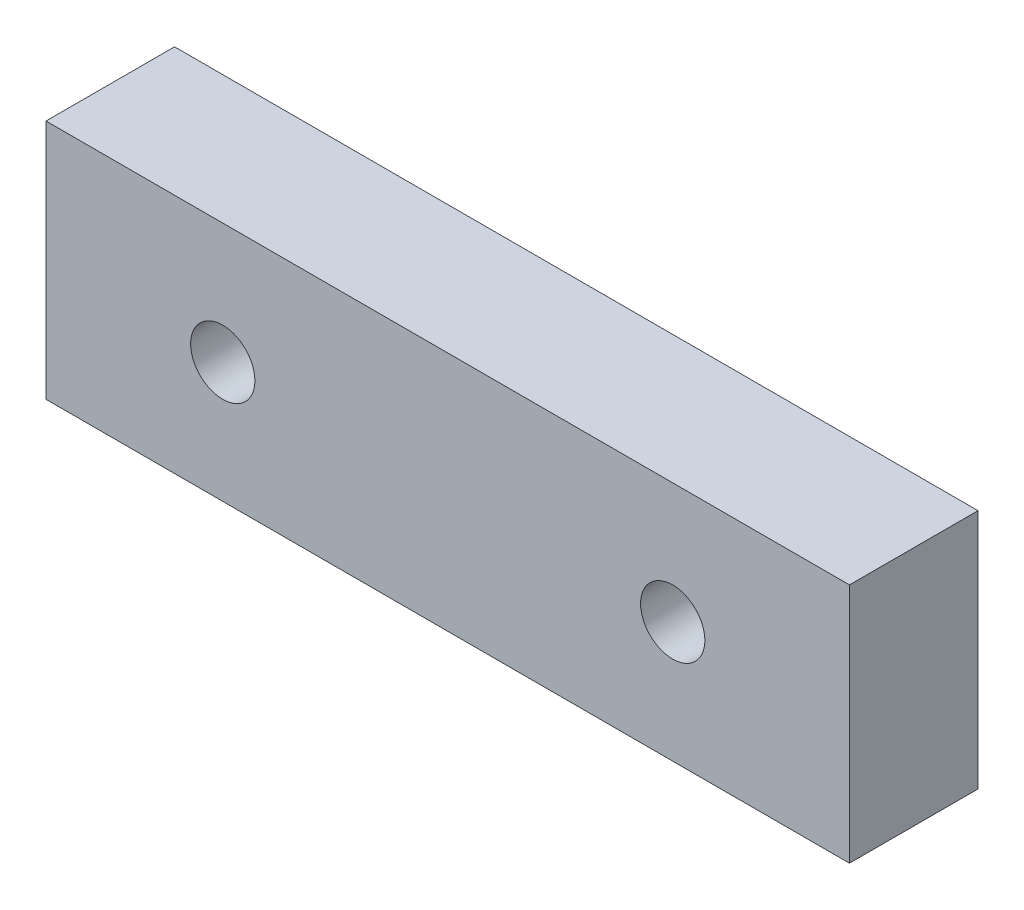
ISO-10303-21;
HEADER;
FILE_DESCRIPTION(('STEP AP214'),'2;1');
FILE_NAME('part.step','',(''),(''),'','','');
FILE_SCHEMA(('AUTOMOTIVE_DESIGN { 1 0 10303 214 1 1 1 1 }'));
ENDSEC;
DATA;
#1=APPLICATION_CONTEXT('core data for automotive mechanical design processes');
#2=APPLICATION_PROTOCOL_DEFINITION('international standard','automotive_design',2000,#1);
#3=PRODUCT_CONTEXT('',#1,'mechanical');
#4=PRODUCT('Part','Part','',(#3));
#5=PRODUCT_RELATED_PRODUCT_CATEGORY('part','',(#4));
#6=PRODUCT_DEFINITION_FORMATION('','',#4);
#7=PRODUCT_DEFINITION_CONTEXT('part definition',#1,'design');
#8=PRODUCT_DEFINITION('design','',#6,#7);
#9=PRODUCT_DEFINITION_SHAPE('','',#8);
#10=(LENGTH_UNIT() NAMED_UNIT(*) SI_UNIT(.MILLI.,.METRE.));
#11=(NAMED_UNIT(*) PLANE_ANGLE_UNIT() SI_UNIT($,.RADIAN.));
#12=(NAMED_UNIT(*) SI_UNIT($,.STERADIAN.) SOLID_ANGLE_UNIT());
#13=UNCERTAINTY_MEASURE_WITH_UNIT(LENGTH_MEASURE(1.E-05),#10,'distance_accuracy_value','');
#14=(GEOMETRIC_REPRESENTATION_CONTEXT(3) GLOBAL_UNCERTAINTY_ASSIGNED_CONTEXT((#13)) GLOBAL_UNIT_ASSIGNED_CONTEXT((#10,
#11,#12)) REPRESENTATION_CONTEXT('',''));
#15=CARTESIAN_POINT('',(0.,0.,0.));
#16=DIRECTION('',(0.,0.,1.));
#17=DIRECTION('',(1.,0.,0.));
#18=AXIS2_PLACEMENT_3D('',#15,#16,#17);
#19=CARTESIAN_POINT('',(25.,7.5,8.));
#20=DIRECTION('',(-1.,0.,0.));
#21=DIRECTION('',(0.,0.,1.));
#22=AXIS2_PLACEMENT_3D('',#19,#20,#21);
#23=PLANE('',#22);
#24=DIRECTION('',(0.,1.,0.));
#25=VECTOR('',#24,1.);
#26=CARTESIAN_POINT('',(25.,7.5,0.));
#27=LINE('',#26,#25);
#28=CARTESIAN_POINT('',(25.,-7.5,0.));
#29=VERTEX_POINT('',#28);
#30=CARTESIAN_POINT('',(25.,7.5,0.));
#31=VERTEX_POINT('',#30);
#32=EDGE_CURVE('E107',#29,#31,#27,.T.);
#33=ORIENTED_EDGE('',*,*,#32,.T.);
#34=DIRECTION('',(0.,0.,-1.));
#35=VECTOR('',#34,1.);
#36=CARTESIAN_POINT('',(25.,7.5,8.));
#37=LINE('',#36,#35);
#38=CARTESIAN_POINT('',(25.,7.5,8.));
#39=VERTEX_POINT('',#38);
#40=EDGE_CURVE('E11',#39,#31,#37,.T.);
#41=ORIENTED_EDGE('',*,*,#40,.F.);
#42=DIRECTION('',(0.,1.,0.));
#43=VECTOR('',#42,1.);
#44=CARTESIAN_POINT('',(25.,7.5,8.));
#45=LINE('',#44,#43);
#46=CARTESIAN_POINT('',(25.,-7.5,8.));
#47=VERTEX_POINT('',#46);
#48=EDGE_CURVE('E91',#47,#39,#45,.T.);
#49=ORIENTED_EDGE('',*,*,#48,.F.);
#50=DIRECTION('',(0.,0.,-1.));
#51=VECTOR('',#50,1.);
#52=CARTESIAN_POINT('',(25.,-7.5,8.));
#53=LINE('',#52,#51);
#54=EDGE_CURVE('E103',#47,#29,#53,.T.);
#55=ORIENTED_EDGE('',*,*,#54,.T.);
#56=EDGE_LOOP('',(#33,#41,#49,#55));
#57=FACE_BOUND('',#56,.T.);
#58=ADVANCED_FACE('F39',(#57),#23,.F.);
#59=CARTESIAN_POINT('',(-25.,7.5,8.));
#60=DIRECTION('',(0.,-1.,0.));
#61=DIRECTION('',(0.,0.,-1.));
#62=AXIS2_PLACEMENT_3D('',#59,#60,#61);
#63=PLANE('',#62);
#64=DIRECTION('',(-1.,0.,0.));
#65=VECTOR('',#64,1.);
#66=CARTESIAN_POINT('',(-25.,7.5,0.));
#67=LINE('',#66,#65);
#68=CARTESIAN_POINT('',(-25.,7.5,0.));
#69=VERTEX_POINT('',#68);
#70=EDGE_CURVE('E96',#31,#69,#67,.T.);
#71=ORIENTED_EDGE('',*,*,#70,.T.);
#72=DIRECTION('',(0.,0.,-1.));
#73=VECTOR('',#72,1.);
#74=CARTESIAN_POINT('',(-25.,7.5,8.));
#75=LINE('',#74,#73);
#76=CARTESIAN_POINT('',(-25.,7.5,8.));
#77=VERTEX_POINT('',#76);
#78=EDGE_CURVE('E48',#77,#69,#75,.T.);
#79=ORIENTED_EDGE('',*,*,#78,.F.);
#80=DIRECTION('',(-1.,0.,0.));
#81=VECTOR('',#80,1.);
#82=CARTESIAN_POINT('',(-25.,7.5,8.));
#83=LINE('',#82,#81);
#84=EDGE_CURVE('E86',#39,#77,#83,.T.);
#85=ORIENTED_EDGE('',*,*,#84,.F.);
#86=ORIENTED_EDGE('',*,*,#40,.T.);
#87=EDGE_LOOP('',(#71,#79,#85,#86));
#88=FACE_BOUND('',#87,.T.);
#89=ADVANCED_FACE('F95',(#88),#63,.F.);
#90=CARTESIAN_POINT('',(-25.,7.5,8.));
#91=DIRECTION('',(1.,0.,0.));
#92=DIRECTION('',(0.,0.,-1.));
#93=AXIS2_PLACEMENT_3D('',#90,#91,#92);
#94=PLANE('',#93);
#95=DIRECTION('',(0.,-1.,0.));
#96=VECTOR('',#95,1.);
#97=CARTESIAN_POINT('',(-25.,7.5,0.));
#98=LINE('',#97,#96);
#99=CARTESIAN_POINT('',(-25.,-7.5,0.));
#100=VERTEX_POINT('',#99);
#101=EDGE_CURVE('E73',#69,#100,#98,.T.);
#102=ORIENTED_EDGE('',*,*,#101,.T.);
#103=DIRECTION('',(0.,0.,-1.));
#104=VECTOR('',#103,1.);
#105=CARTESIAN_POINT('',(-25.,-7.5,8.));
#106=LINE('',#105,#104);
#107=CARTESIAN_POINT('',(-25.,-7.5,8.));
#108=VERTEX_POINT('',#107);
#109=EDGE_CURVE('E98',#108,#100,#106,.T.);
#110=ORIENTED_EDGE('',*,*,#109,.F.);
#111=DIRECTION('',(0.,-1.,0.));
#112=VECTOR('',#111,1.);
#113=CARTESIAN_POINT('',(-25.,7.5,8.));
#114=LINE('',#113,#112);
#115=EDGE_CURVE('E89',#77,#108,#114,.T.);
#116=ORIENTED_EDGE('',*,*,#115,.F.);
#117=ORIENTED_EDGE('',*,*,#78,.T.);
#118=EDGE_LOOP('',(#102,#110,#116,#117));
#119=FACE_BOUND('',#118,.T.);
#120=ADVANCED_FACE('F99',(#119),#94,.F.);
#121=CARTESIAN_POINT('',(-25.,-7.5,8.));
#122=DIRECTION('',(0.,1.,0.));
#123=DIRECTION('',(0.,0.,1.));
#124=AXIS2_PLACEMENT_3D('',#121,#122,#123);
#125=PLANE('',#124);
#126=DIRECTION('',(1.,0.,0.));
#127=VECTOR('',#126,1.);
#128=CARTESIAN_POINT('',(-25.,-7.5,0.));
#129=LINE('',#128,#127);
#130=EDGE_CURVE('E79',#100,#29,#129,.T.);
#131=ORIENTED_EDGE('',*,*,#130,.T.);
#132=ORIENTED_EDGE('',*,*,#54,.F.);
#133=DIRECTION('',(1.,0.,0.));
#134=VECTOR('',#133,1.);
#135=CARTESIAN_POINT('',(-25.,-7.5,8.));
#136=LINE('',#135,#134);
#137=EDGE_CURVE('E56',#108,#47,#136,.T.);
#138=ORIENTED_EDGE('',*,*,#137,.F.);
#139=ORIENTED_EDGE('',*,*,#109,.T.);
#140=EDGE_LOOP('',(#131,#132,#138,#139));
#141=FACE_BOUND('',#140,.T.);
#142=ADVANCED_FACE('F121',(#141),#125,.F.);
#143=CARTESIAN_POINT('',(0.,0.,8.));
#144=DIRECTION('',(0.,0.,1.));
#145=DIRECTION('',(1.,0.,0.));
#146=AXIS2_PLACEMENT_3D('',#143,#144,#145);
#147=PLANE('',#146);
#148=CARTESIAN_POINT('',(-14.,0.,8.));
#149=DIRECTION('',(0.,0.,1.));
#150=DIRECTION('',(1.,0.,0.));
#151=AXIS2_PLACEMENT_3D('',#148,#149,#150);
#152=CIRCLE('',#151,2.);
#153=CARTESIAN_POINT('',(-12.,0.,8.));
#154=VERTEX_POINT('',#153);
#155=EDGE_CURVE('E136',#154,#154,#152,.T.);
#156=ORIENTED_EDGE('',*,*,#155,.F.);
#157=EDGE_LOOP('',(#156));
#158=FACE_BOUND('',#157,.T.);
#159=CARTESIAN_POINT('',(14.,0.,8.));
#160=DIRECTION('',(0.,0.,1.));
#161=DIRECTION('',(-1.,0.,0.));
#162=AXIS2_PLACEMENT_3D('',#159,#160,#161);
#163=CIRCLE('',#162,2.);
#164=CARTESIAN_POINT('',(12.,0.,8.));
#165=VERTEX_POINT('',#164);
#166=EDGE_CURVE('E128',#165,#165,#163,.T.);
#167=ORIENTED_EDGE('',*,*,#166,.F.);
#168=EDGE_LOOP('',(#167));
#169=FACE_BOUND('',#168,.T.);
#170=ORIENTED_EDGE('',*,*,#48,.T.);
#171=ORIENTED_EDGE('',*,*,#84,.T.);
#172=ORIENTED_EDGE('',*,*,#115,.T.);
#173=ORIENTED_EDGE('',*,*,#137,.T.);
#174=EDGE_LOOP('',(#170,#171,#172,#173));
#175=FACE_BOUND('',#174,.T.);
#176=ADVANCED_FACE('F87',(#158,#169,#175),#147,.T.);
#177=CARTESIAN_POINT('',(0.,0.,0.));
#178=DIRECTION('',(0.,0.,1.));
#179=DIRECTION('',(1.,0.,0.));
#180=AXIS2_PLACEMENT_3D('',#177,#178,#179);
#181=PLANE('',#180);
#182=CARTESIAN_POINT('',(-14.,0.,0.));
#183=DIRECTION('',(0.,0.,1.));
#184=DIRECTION('',(1.,0.,0.));
#185=AXIS2_PLACEMENT_3D('',#182,#183,#184);
#186=CIRCLE('',#185,2.);
#187=CARTESIAN_POINT('',(-12.,0.,0.));
#188=VERTEX_POINT('',#187);
#189=EDGE_CURVE('E111',#188,#188,#186,.T.);
#190=ORIENTED_EDGE('',*,*,#189,.T.);
#191=EDGE_LOOP('',(#190));
#192=FACE_BOUND('',#191,.T.);
#193=CARTESIAN_POINT('',(14.,0.,0.));
#194=DIRECTION('',(0.,0.,1.));
#195=DIRECTION('',(-1.,0.,0.));
#196=AXIS2_PLACEMENT_3D('',#193,#194,#195);
#197=CIRCLE('',#196,2.);
#198=CARTESIAN_POINT('',(12.,0.,0.));
#199=VERTEX_POINT('',#198);
#200=EDGE_CURVE('E132',#199,#199,#197,.T.);
#201=ORIENTED_EDGE('',*,*,#200,.T.);
#202=EDGE_LOOP('',(#201));
#203=FACE_BOUND('',#202,.T.);
#204=ORIENTED_EDGE('',*,*,#32,.F.);
#205=ORIENTED_EDGE('',*,*,#130,.F.);
#206=ORIENTED_EDGE('',*,*,#101,.F.);
#207=ORIENTED_EDGE('',*,*,#70,.F.);
#208=EDGE_LOOP('',(#204,#205,#206,#207));
#209=FACE_BOUND('',#208,.T.);
#210=ADVANCED_FACE('F124',(#192,#203,#209),#181,.F.);
#211=CARTESIAN_POINT('',(14.,0.,0.));
#212=DIRECTION('',(0.,0.,1.));
#213=DIRECTION('',(1.,0.,0.));
#214=AXIS2_PLACEMENT_3D('',#211,#212,#213);
#215=CYLINDRICAL_SURFACE('',#214,2.);
#216=ORIENTED_EDGE('',*,*,#200,.F.);
#217=EDGE_LOOP('',(#216));
#218=FACE_BOUND('',#217,.T.);
#219=ORIENTED_EDGE('',*,*,#166,.T.);
#220=EDGE_LOOP('',(#219));
#221=FACE_BOUND('',#220,.T.);
#222=ADVANCED_FACE('F149',(#218,#221),#215,.F.);
#223=CARTESIAN_POINT('',(-14.,0.,0.));
#224=DIRECTION('',(0.,0.,1.));
#225=DIRECTION('',(1.,0.,0.));
#226=AXIS2_PLACEMENT_3D('',#223,#224,#225);
#227=CYLINDRICAL_SURFACE('',#226,2.);
#228=ORIENTED_EDGE('',*,*,#189,.F.);
#229=EDGE_LOOP('',(#228));
#230=FACE_BOUND('',#229,.T.);
#231=ORIENTED_EDGE('',*,*,#155,.T.);
#232=EDGE_LOOP('',(#231));
#233=FACE_BOUND('',#232,.T.);
#234=ADVANCED_FACE('F146',(#230,#233),#227,.F.);
#235=CLOSED_SHELL('',(#58,#89,#120,#142,#176,#210,#222,#234));
#236=MANIFOLD_SOLID_BREP('B2',#235);
#237=ADVANCED_BREP_SHAPE_REPRESENTATION('',(#18,#236),#14);
#238=SHAPE_DEFINITION_REPRESENTATION(#9,#237);
ENDSEC;
END-ISO-10303-21;
